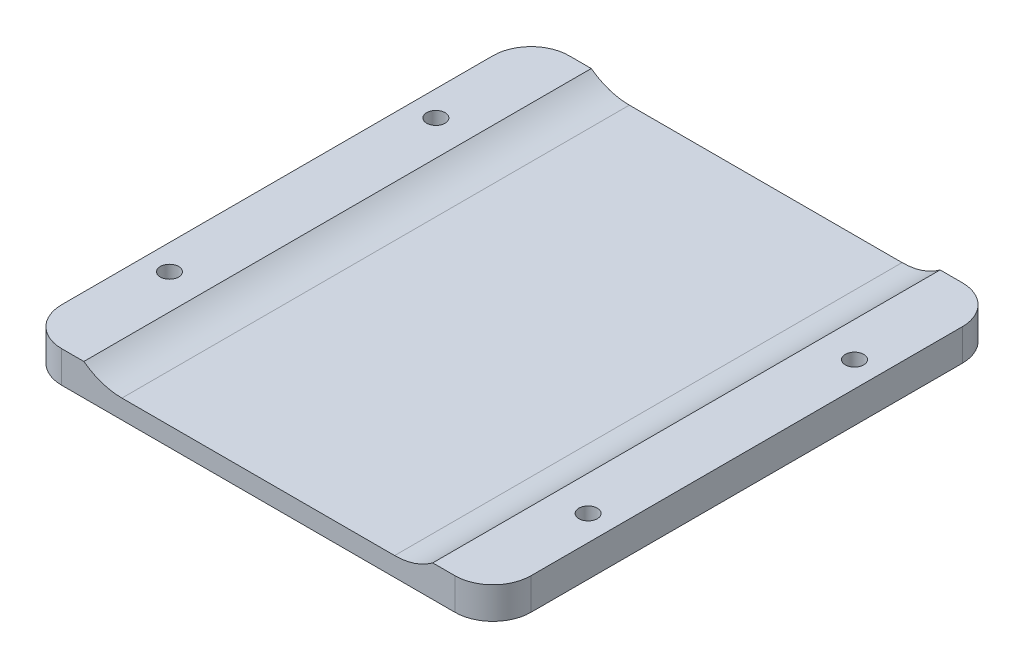
ISO-10303-21;
HEADER;
FILE_DESCRIPTION(('STEP AP214'),'2;1');
FILE_NAME('part.step','',(''),(''),'','','');
FILE_SCHEMA(('AUTOMOTIVE_DESIGN { 1 0 10303 214 1 1 1 1 }'));
ENDSEC;
DATA;
#1=APPLICATION_CONTEXT('core data for automotive mechanical design processes');
#2=APPLICATION_PROTOCOL_DEFINITION('international standard','automotive_design',2000,#1);
#3=PRODUCT_CONTEXT('',#1,'mechanical');
#4=PRODUCT('Part','Part','',(#3));
#5=PRODUCT_RELATED_PRODUCT_CATEGORY('part','',(#4));
#6=PRODUCT_DEFINITION_FORMATION('','',#4);
#7=PRODUCT_DEFINITION_CONTEXT('part definition',#1,'design');
#8=PRODUCT_DEFINITION('design','',#6,#7);
#9=PRODUCT_DEFINITION_SHAPE('','',#8);
#10=(LENGTH_UNIT() NAMED_UNIT(*) SI_UNIT(.MILLI.,.METRE.));
#11=(NAMED_UNIT(*) PLANE_ANGLE_UNIT() SI_UNIT($,.RADIAN.));
#12=(NAMED_UNIT(*) SI_UNIT($,.STERADIAN.) SOLID_ANGLE_UNIT());
#13=UNCERTAINTY_MEASURE_WITH_UNIT(LENGTH_MEASURE(1.E-05),#10,'distance_accuracy_value','');
#14=(GEOMETRIC_REPRESENTATION_CONTEXT(3) GLOBAL_UNCERTAINTY_ASSIGNED_CONTEXT((#13)) GLOBAL_UNIT_ASSIGNED_CONTEXT((#10,
#11,#12)) REPRESENTATION_CONTEXT('',''));
#15=CARTESIAN_POINT('',(0.,0.,0.));
#16=DIRECTION('',(0.,0.,1.));
#17=DIRECTION('',(1.,0.,0.));
#18=AXIS2_PLACEMENT_3D('',#15,#16,#17);
#19=CARTESIAN_POINT('',(0.,5.,0.));
#20=DIRECTION('',(0.,1.,0.));
#21=DIRECTION('',(0.,0.,1.));
#22=AXIS2_PLACEMENT_3D('',#19,#20,#21);
#23=PLANE('',#22);
#24=DIRECTION('',(0.,0.,-1.));
#25=VECTOR('',#24,1.);
#26=CARTESIAN_POINT('',(27.5,5.,40.));
#27=LINE('',#26,#25);
#28=CARTESIAN_POINT('',(27.5,5.,40.));
#29=VERTEX_POINT('',#28);
#30=CARTESIAN_POINT('',(27.5,5.,-40.));
#31=VERTEX_POINT('',#30);
#32=EDGE_CURVE('E141',#29,#31,#27,.T.);
#33=ORIENTED_EDGE('',*,*,#32,.F.);
#34=DIRECTION('',(1.,0.,0.));
#35=VECTOR('',#34,1.);
#36=CARTESIAN_POINT('',(-37.,5.,40.));
#37=LINE('',#36,#35);
#38=CARTESIAN_POINT('',(31.,5.,40.));
#39=VERTEX_POINT('',#38);
#40=EDGE_CURVE('E185',#29,#39,#37,.T.);
#41=ORIENTED_EDGE('',*,*,#40,.T.);
#42=CARTESIAN_POINT('',(31.,5.,34.));
#43=DIRECTION('',(0.,1.,0.));
#44=DIRECTION('',(0.,0.,1.));
#45=AXIS2_PLACEMENT_3D('',#42,#43,#44);
#46=CIRCLE('',#45,6.);
#47=CARTESIAN_POINT('',(37.,5.,34.));
#48=VERTEX_POINT('',#47);
#49=EDGE_CURVE('E217',#39,#48,#46,.T.);
#50=ORIENTED_EDGE('',*,*,#49,.T.);
#51=DIRECTION('',(0.,0.,-1.));
#52=VECTOR('',#51,1.);
#53=CARTESIAN_POINT('',(37.,5.,-40.));
#54=LINE('',#53,#52);
#55=CARTESIAN_POINT('',(37.,5.,-34.));
#56=VERTEX_POINT('',#55);
#57=EDGE_CURVE('E180',#48,#56,#54,.T.);
#58=ORIENTED_EDGE('',*,*,#57,.T.);
#59=CARTESIAN_POINT('',(31.,5.,-34.));
#60=DIRECTION('',(0.,1.,0.));
#61=DIRECTION('',(0.,0.,1.));
#62=AXIS2_PLACEMENT_3D('',#59,#60,#61);
#63=CIRCLE('',#62,6.);
#64=CARTESIAN_POINT('',(31.,5.,-40.));
#65=VERTEX_POINT('',#64);
#66=EDGE_CURVE('E144',#56,#65,#63,.T.);
#67=ORIENTED_EDGE('',*,*,#66,.T.);
#68=DIRECTION('',(-1.,0.,0.));
#69=VECTOR('',#68,1.);
#70=CARTESIAN_POINT('',(-37.,5.,-40.));
#71=LINE('',#70,#69);
#72=EDGE_CURVE('E130',#65,#31,#71,.T.);
#73=ORIENTED_EDGE('',*,*,#72,.T.);
#74=EDGE_LOOP('',(#33,#41,#50,#58,#67,#73));
#75=FACE_BOUND('',#74,.T.);
#76=CARTESIAN_POINT('',(33.,5.,-21.));
#77=DIRECTION('',(0.,1.,0.));
#78=DIRECTION('',(0.,0.,-1.));
#79=AXIS2_PLACEMENT_3D('',#76,#77,#78);
#80=CIRCLE('',#79,1.45);
#81=CARTESIAN_POINT('',(33.,5.,-22.45));
#82=VERTEX_POINT('',#81);
#83=EDGE_CURVE('E155',#82,#82,#80,.T.);
#84=ORIENTED_EDGE('',*,*,#83,.F.);
#85=EDGE_LOOP('',(#84));
#86=FACE_BOUND('',#85,.T.);
#87=CARTESIAN_POINT('',(33.,5.,21.));
#88=DIRECTION('',(0.,1.,0.));
#89=DIRECTION('',(0.,0.,1.));
#90=AXIS2_PLACEMENT_3D('',#87,#88,#89);
#91=CIRCLE('',#90,1.45);
#92=CARTESIAN_POINT('',(33.,5.,22.45));
#93=VERTEX_POINT('',#92);
#94=EDGE_CURVE('E162',#93,#93,#91,.T.);
#95=ORIENTED_EDGE('',*,*,#94,.F.);
#96=EDGE_LOOP('',(#95));
#97=FACE_BOUND('',#96,.T.);
#98=ADVANCED_FACE('F37',(#75,#86,#97),#23,.T.);
#99=DIRECTION('',(0.,0.,1.));
#100=VECTOR('',#99,1.);
#101=CARTESIAN_POINT('',(-27.5,5.,40.));
#102=LINE('',#101,#100);
#103=CARTESIAN_POINT('',(-27.5,5.,-40.));
#104=VERTEX_POINT('',#103);
#105=CARTESIAN_POINT('',(-27.5,5.,40.));
#106=VERTEX_POINT('',#105);
#107=EDGE_CURVE('E148',#104,#106,#102,.T.);
#108=ORIENTED_EDGE('',*,*,#107,.F.);
#109=CARTESIAN_POINT('',(-31.,5.,-40.));
#110=VERTEX_POINT('',#109);
#111=EDGE_CURVE('E146',#104,#110,#71,.T.);
#112=ORIENTED_EDGE('',*,*,#111,.T.);
#113=CARTESIAN_POINT('',(-31.,5.,-34.));
#114=DIRECTION('',(0.,1.,0.));
#115=DIRECTION('',(0.,0.,1.));
#116=AXIS2_PLACEMENT_3D('',#113,#114,#115);
#117=CIRCLE('',#116,6.);
#118=CARTESIAN_POINT('',(-37.,5.,-34.));
#119=VERTEX_POINT('',#118);
#120=EDGE_CURVE('E221',#110,#119,#117,.T.);
#121=ORIENTED_EDGE('',*,*,#120,.T.);
#122=DIRECTION('',(0.,0.,1.));
#123=VECTOR('',#122,1.);
#124=CARTESIAN_POINT('',(-37.,5.,-40.));
#125=LINE('',#124,#123);
#126=CARTESIAN_POINT('',(-37.,5.,34.));
#127=VERTEX_POINT('',#126);
#128=EDGE_CURVE('E145',#119,#127,#125,.T.);
#129=ORIENTED_EDGE('',*,*,#128,.T.);
#130=CARTESIAN_POINT('',(-31.,5.,34.));
#131=DIRECTION('',(0.,1.,0.));
#132=DIRECTION('',(0.,0.,1.));
#133=AXIS2_PLACEMENT_3D('',#130,#131,#132);
#134=CIRCLE('',#133,6.);
#135=CARTESIAN_POINT('',(-31.,5.,40.));
#136=VERTEX_POINT('',#135);
#137=EDGE_CURVE('E219',#127,#136,#134,.T.);
#138=ORIENTED_EDGE('',*,*,#137,.T.);
#139=EDGE_CURVE('E186',#136,#106,#37,.T.);
#140=ORIENTED_EDGE('',*,*,#139,.T.);
#141=EDGE_LOOP('',(#108,#112,#121,#129,#138,#140));
#142=FACE_BOUND('',#141,.T.);
#143=CARTESIAN_POINT('',(-33.,5.,-21.));
#144=DIRECTION('',(0.,1.,0.));
#145=DIRECTION('',(0.,0.,1.));
#146=AXIS2_PLACEMENT_3D('',#143,#144,#145);
#147=CIRCLE('',#146,1.45);
#148=CARTESIAN_POINT('',(-33.,5.,-19.55));
#149=VERTEX_POINT('',#148);
#150=EDGE_CURVE('E174',#149,#149,#147,.T.);
#151=ORIENTED_EDGE('',*,*,#150,.F.);
#152=EDGE_LOOP('',(#151));
#153=FACE_BOUND('',#152,.T.);
#154=CARTESIAN_POINT('',(-33.,5.,21.));
#155=DIRECTION('',(0.,1.,0.));
#156=DIRECTION('',(0.,0.,-1.));
#157=AXIS2_PLACEMENT_3D('',#154,#155,#156);
#158=CIRCLE('',#157,1.45);
#159=CARTESIAN_POINT('',(-33.,5.,19.55));
#160=VERTEX_POINT('',#159);
#161=EDGE_CURVE('E168',#160,#160,#158,.T.);
#162=ORIENTED_EDGE('',*,*,#161,.F.);
#163=EDGE_LOOP('',(#162));
#164=FACE_BOUND('',#163,.T.);
#165=ADVANCED_FACE('F254',(#142,#153,#164),#23,.T.);
#166=CARTESIAN_POINT('',(0.,0.,0.));
#167=DIRECTION('',(0.,1.,0.));
#168=DIRECTION('',(0.,0.,1.));
#169=AXIS2_PLACEMENT_3D('',#166,#167,#168);
#170=PLANE('',#169);
#171=DIRECTION('',(-1.,0.,0.));
#172=VECTOR('',#171,1.);
#173=CARTESIAN_POINT('',(-37.,0.,-40.));
#174=LINE('',#173,#172);
#175=CARTESIAN_POINT('',(31.,0.,-40.));
#176=VERTEX_POINT('',#175);
#177=CARTESIAN_POINT('',(-31.,0.,-40.));
#178=VERTEX_POINT('',#177);
#179=EDGE_CURVE('E192',#176,#178,#174,.T.);
#180=ORIENTED_EDGE('',*,*,#179,.F.);
#181=CARTESIAN_POINT('',(31.,0.,-34.));
#182=DIRECTION('',(0.,1.,0.));
#183=DIRECTION('',(0.,0.,1.));
#184=AXIS2_PLACEMENT_3D('',#181,#182,#183);
#185=CIRCLE('',#184,6.);
#186=CARTESIAN_POINT('',(37.,0.,-34.));
#187=VERTEX_POINT('',#186);
#188=EDGE_CURVE('E210',#176,#187,#185,.F.);
#189=ORIENTED_EDGE('',*,*,#188,.T.);
#190=DIRECTION('',(0.,0.,-1.));
#191=VECTOR('',#190,1.);
#192=CARTESIAN_POINT('',(37.,0.,-40.));
#193=LINE('',#192,#191);
#194=CARTESIAN_POINT('',(37.,0.,34.));
#195=VERTEX_POINT('',#194);
#196=EDGE_CURVE('E177',#195,#187,#193,.T.);
#197=ORIENTED_EDGE('',*,*,#196,.F.);
#198=CARTESIAN_POINT('',(31.,0.,34.));
#199=DIRECTION('',(0.,1.,0.));
#200=DIRECTION('',(0.,0.,1.));
#201=AXIS2_PLACEMENT_3D('',#198,#199,#200);
#202=CIRCLE('',#201,6.);
#203=CARTESIAN_POINT('',(31.,0.,40.));
#204=VERTEX_POINT('',#203);
#205=EDGE_CURVE('E204',#195,#204,#202,.F.);
#206=ORIENTED_EDGE('',*,*,#205,.T.);
#207=DIRECTION('',(1.,0.,0.));
#208=VECTOR('',#207,1.);
#209=CARTESIAN_POINT('',(-37.,0.,40.));
#210=LINE('',#209,#208);
#211=CARTESIAN_POINT('',(-31.,0.,40.));
#212=VERTEX_POINT('',#211);
#213=EDGE_CURVE('E181',#212,#204,#210,.T.);
#214=ORIENTED_EDGE('',*,*,#213,.F.);
#215=CARTESIAN_POINT('',(-31.,0.,34.));
#216=DIRECTION('',(0.,1.,0.));
#217=DIRECTION('',(0.,0.,1.));
#218=AXIS2_PLACEMENT_3D('',#215,#216,#217);
#219=CIRCLE('',#218,6.);
#220=CARTESIAN_POINT('',(-37.,0.,34.));
#221=VERTEX_POINT('',#220);
#222=EDGE_CURVE('E206',#212,#221,#219,.F.);
#223=ORIENTED_EDGE('',*,*,#222,.T.);
#224=DIRECTION('',(0.,0.,1.));
#225=VECTOR('',#224,1.);
#226=CARTESIAN_POINT('',(-37.,0.,-40.));
#227=LINE('',#226,#225);
#228=CARTESIAN_POINT('',(-37.,0.,-34.));
#229=VERTEX_POINT('',#228);
#230=EDGE_CURVE('E195',#229,#221,#227,.T.);
#231=ORIENTED_EDGE('',*,*,#230,.F.);
#232=CARTESIAN_POINT('',(-31.,0.,-34.));
#233=DIRECTION('',(0.,1.,0.));
#234=DIRECTION('',(0.,0.,1.));
#235=AXIS2_PLACEMENT_3D('',#232,#233,#234);
#236=CIRCLE('',#235,6.);
#237=EDGE_CURVE('E208',#229,#178,#236,.F.);
#238=ORIENTED_EDGE('',*,*,#237,.T.);
#239=EDGE_LOOP('',(#180,#189,#197,#206,#214,#223,#231,#238));
#240=FACE_BOUND('',#239,.T.);
#241=CARTESIAN_POINT('',(-33.,0.,-21.));
#242=DIRECTION('',(0.,1.,0.));
#243=DIRECTION('',(0.,0.,1.));
#244=AXIS2_PLACEMENT_3D('',#241,#242,#243);
#245=CIRCLE('',#244,1.45);
#246=CARTESIAN_POINT('',(-33.,0.,-19.55));
#247=VERTEX_POINT('',#246);
#248=EDGE_CURVE('E171',#247,#247,#245,.T.);
#249=ORIENTED_EDGE('',*,*,#248,.T.);
#250=EDGE_LOOP('',(#249));
#251=FACE_BOUND('',#250,.T.);
#252=CARTESIAN_POINT('',(-33.,0.,21.));
#253=DIRECTION('',(0.,1.,0.));
#254=DIRECTION('',(0.,0.,-1.));
#255=AXIS2_PLACEMENT_3D('',#252,#253,#254);
#256=CIRCLE('',#255,1.45);
#257=CARTESIAN_POINT('',(-33.,0.,19.55));
#258=VERTEX_POINT('',#257);
#259=EDGE_CURVE('E165',#258,#258,#256,.T.);
#260=ORIENTED_EDGE('',*,*,#259,.T.);
#261=EDGE_LOOP('',(#260));
#262=FACE_BOUND('',#261,.T.);
#263=CARTESIAN_POINT('',(33.,0.,21.));
#264=DIRECTION('',(0.,1.,0.));
#265=DIRECTION('',(0.,0.,1.));
#266=AXIS2_PLACEMENT_3D('',#263,#264,#265);
#267=CIRCLE('',#266,1.45);
#268=CARTESIAN_POINT('',(33.,0.,22.45));
#269=VERTEX_POINT('',#268);
#270=EDGE_CURVE('E158',#269,#269,#267,.T.);
#271=ORIENTED_EDGE('',*,*,#270,.T.);
#272=EDGE_LOOP('',(#271));
#273=FACE_BOUND('',#272,.T.);
#274=CARTESIAN_POINT('',(33.,0.,-21.));
#275=DIRECTION('',(0.,1.,0.));
#276=DIRECTION('',(0.,0.,-1.));
#277=AXIS2_PLACEMENT_3D('',#274,#275,#276);
#278=CIRCLE('',#277,1.45);
#279=CARTESIAN_POINT('',(33.,0.,-22.45));
#280=VERTEX_POINT('',#279);
#281=EDGE_CURVE('E159',#280,#280,#278,.T.);
#282=ORIENTED_EDGE('',*,*,#281,.T.);
#283=EDGE_LOOP('',(#282));
#284=FACE_BOUND('',#283,.T.);
#285=ADVANCED_FACE('F259',(#240,#251,#262,#273,#284),#170,.F.);
#286=CARTESIAN_POINT('',(37.,5.,-40.));
#287=DIRECTION('',(-1.,0.,0.));
#288=DIRECTION('',(0.,0.,1.));
#289=AXIS2_PLACEMENT_3D('',#286,#287,#288);
#290=PLANE('',#289);
#291=ORIENTED_EDGE('',*,*,#196,.T.);
#292=DIRECTION('',(0.,-1.,0.));
#293=VECTOR('',#292,1.);
#294=CARTESIAN_POINT('',(37.,5.,-34.));
#295=LINE('',#294,#293);
#296=EDGE_CURVE('E215',#187,#56,#295,.F.);
#297=ORIENTED_EDGE('',*,*,#296,.T.);
#298=ORIENTED_EDGE('',*,*,#57,.F.);
#299=DIRECTION('',(0.,-1.,0.));
#300=VECTOR('',#299,1.);
#301=CARTESIAN_POINT('',(37.,5.,34.));
#302=LINE('',#301,#300);
#303=EDGE_CURVE('E212',#48,#195,#302,.T.);
#304=ORIENTED_EDGE('',*,*,#303,.T.);
#305=EDGE_LOOP('',(#291,#297,#298,#304));
#306=FACE_BOUND('',#305,.T.);
#307=ADVANCED_FACE('F267',(#306),#290,.F.);
#308=CARTESIAN_POINT('',(-37.,5.,-40.));
#309=DIRECTION('',(0.,0.,1.));
#310=DIRECTION('',(1.,0.,0.));
#311=AXIS2_PLACEMENT_3D('',#308,#309,#310);
#312=PLANE('',#311);
#313=DIRECTION('',(-1.,0.,0.));
#314=VECTOR('',#313,1.);
#315=CARTESIAN_POINT('',(-27.5,3.,-40.));
#316=LINE('',#315,#314);
#317=CARTESIAN_POINT('',(21.5,3.,-40.));
#318=VERTEX_POINT('',#317);
#319=CARTESIAN_POINT('',(-21.5,3.,-40.));
#320=VERTEX_POINT('',#319);
#321=EDGE_CURVE('E133',#318,#320,#316,.T.);
#322=ORIENTED_EDGE('',*,*,#321,.F.);
#323=CARTESIAN_POINT('',(21.5,13.,-40.));
#324=DIRECTION('',(0.,0.,1.));
#325=DIRECTION('',(1.,0.,0.));
#326=AXIS2_PLACEMENT_3D('',#323,#324,#325);
#327=CIRCLE('',#326,10.);
#328=EDGE_CURVE('E45',#318,#31,#327,.T.);
#329=ORIENTED_EDGE('',*,*,#328,.T.);
#330=ORIENTED_EDGE('',*,*,#72,.F.);
#331=DIRECTION('',(0.,-1.,0.));
#332=VECTOR('',#331,1.);
#333=CARTESIAN_POINT('',(31.,5.,-40.));
#334=LINE('',#333,#332);
#335=EDGE_CURVE('E202',#65,#176,#334,.T.);
#336=ORIENTED_EDGE('',*,*,#335,.T.);
#337=ORIENTED_EDGE('',*,*,#179,.T.);
#338=DIRECTION('',(0.,-1.,0.));
#339=VECTOR('',#338,1.);
#340=CARTESIAN_POINT('',(-31.,5.,-40.));
#341=LINE('',#340,#339);
#342=EDGE_CURVE('E189',#178,#110,#341,.F.);
#343=ORIENTED_EDGE('',*,*,#342,.T.);
#344=ORIENTED_EDGE('',*,*,#111,.F.);
#345=CARTESIAN_POINT('',(-21.5,13.,-40.));
#346=DIRECTION('',(0.,0.,1.));
#347=DIRECTION('',(1.,0.,0.));
#348=AXIS2_PLACEMENT_3D('',#345,#346,#347);
#349=CIRCLE('',#348,10.);
#350=EDGE_CURVE('E138',#104,#320,#349,.T.);
#351=ORIENTED_EDGE('',*,*,#350,.T.);
#352=EDGE_LOOP('',(#322,#329,#330,#336,#337,#343,#344,#351));
#353=FACE_BOUND('',#352,.T.);
#354=ADVANCED_FACE('F128',(#353),#312,.F.);
#355=CARTESIAN_POINT('',(-37.,5.,-40.));
#356=DIRECTION('',(1.,0.,0.));
#357=DIRECTION('',(0.,0.,-1.));
#358=AXIS2_PLACEMENT_3D('',#355,#356,#357);
#359=PLANE('',#358);
#360=ORIENTED_EDGE('',*,*,#128,.F.);
#361=DIRECTION('',(0.,-1.,0.));
#362=VECTOR('',#361,1.);
#363=CARTESIAN_POINT('',(-37.,5.,-34.));
#364=LINE('',#363,#362);
#365=EDGE_CURVE('E226',#119,#229,#364,.T.);
#366=ORIENTED_EDGE('',*,*,#365,.T.);
#367=ORIENTED_EDGE('',*,*,#230,.T.);
#368=DIRECTION('',(0.,-1.,0.));
#369=VECTOR('',#368,1.);
#370=CARTESIAN_POINT('',(-37.,5.,34.));
#371=LINE('',#370,#369);
#372=EDGE_CURVE('E224',#221,#127,#371,.F.);
#373=ORIENTED_EDGE('',*,*,#372,.T.);
#374=EDGE_LOOP('',(#360,#366,#367,#373));
#375=FACE_BOUND('',#374,.T.);
#376=ADVANCED_FACE('F272',(#375),#359,.F.);
#377=CARTESIAN_POINT('',(-37.,5.,40.));
#378=DIRECTION('',(0.,0.,-1.));
#379=DIRECTION('',(-1.,0.,0.));
#380=AXIS2_PLACEMENT_3D('',#377,#378,#379);
#381=PLANE('',#380);
#382=ORIENTED_EDGE('',*,*,#40,.F.);
#383=CARTESIAN_POINT('',(21.5,13.,40.));
#384=DIRECTION('',(0.,0.,-1.));
#385=DIRECTION('',(-1.,0.,0.));
#386=AXIS2_PLACEMENT_3D('',#383,#384,#385);
#387=CIRCLE('',#386,10.);
#388=CARTESIAN_POINT('',(21.5,3.,40.));
#389=VERTEX_POINT('',#388);
#390=EDGE_CURVE('E11',#29,#389,#387,.T.);
#391=ORIENTED_EDGE('',*,*,#390,.T.);
#392=DIRECTION('',(1.,0.,0.));
#393=VECTOR('',#392,1.);
#394=CARTESIAN_POINT('',(-27.5,3.,40.));
#395=LINE('',#394,#393);
#396=CARTESIAN_POINT('',(-21.5,3.,40.));
#397=VERTEX_POINT('',#396);
#398=EDGE_CURVE('E152',#397,#389,#395,.T.);
#399=ORIENTED_EDGE('',*,*,#398,.F.);
#400=CARTESIAN_POINT('',(-21.5,13.,40.));
#401=DIRECTION('',(0.,0.,-1.));
#402=DIRECTION('',(-1.,0.,0.));
#403=AXIS2_PLACEMENT_3D('',#400,#401,#402);
#404=CIRCLE('',#403,10.);
#405=EDGE_CURVE('E58',#397,#106,#404,.T.);
#406=ORIENTED_EDGE('',*,*,#405,.T.);
#407=ORIENTED_EDGE('',*,*,#139,.F.);
#408=DIRECTION('',(0.,-1.,0.));
#409=VECTOR('',#408,1.);
#410=CARTESIAN_POINT('',(-31.,5.,40.));
#411=LINE('',#410,#409);
#412=EDGE_CURVE('E232',#136,#212,#411,.T.);
#413=ORIENTED_EDGE('',*,*,#412,.T.);
#414=ORIENTED_EDGE('',*,*,#213,.T.);
#415=DIRECTION('',(0.,-1.,0.));
#416=VECTOR('',#415,1.);
#417=CARTESIAN_POINT('',(31.,5.,40.));
#418=LINE('',#417,#416);
#419=EDGE_CURVE('E229',#204,#39,#418,.F.);
#420=ORIENTED_EDGE('',*,*,#419,.T.);
#421=EDGE_LOOP('',(#382,#391,#399,#406,#407,#413,#414,#420));
#422=FACE_BOUND('',#421,.T.);
#423=ADVANCED_FACE('F269',(#422),#381,.F.);
#424=CARTESIAN_POINT('',(-33.,5.,-21.));
#425=DIRECTION('',(0.,-1.,0.));
#426=DIRECTION('',(0.,0.,-1.));
#427=AXIS2_PLACEMENT_3D('',#424,#425,#426);
#428=CYLINDRICAL_SURFACE('',#427,1.45);
#429=ORIENTED_EDGE('',*,*,#150,.T.);
#430=EDGE_LOOP('',(#429));
#431=FACE_BOUND('',#430,.T.);
#432=ORIENTED_EDGE('',*,*,#248,.F.);
#433=EDGE_LOOP('',(#432));
#434=FACE_BOUND('',#433,.T.);
#435=ADVANCED_FACE('F263',(#431,#434),#428,.F.);
#436=CARTESIAN_POINT('',(-33.,5.,21.));
#437=DIRECTION('',(0.,-1.,0.));
#438=DIRECTION('',(0.,0.,-1.));
#439=AXIS2_PLACEMENT_3D('',#436,#437,#438);
#440=CYLINDRICAL_SURFACE('',#439,1.45);
#441=ORIENTED_EDGE('',*,*,#161,.T.);
#442=EDGE_LOOP('',(#441));
#443=FACE_BOUND('',#442,.T.);
#444=ORIENTED_EDGE('',*,*,#259,.F.);
#445=EDGE_LOOP('',(#444));
#446=FACE_BOUND('',#445,.T.);
#447=ADVANCED_FACE('F320',(#443,#446),#440,.F.);
#448=CARTESIAN_POINT('',(33.,5.,21.));
#449=DIRECTION('',(0.,-1.,0.));
#450=DIRECTION('',(0.,0.,-1.));
#451=AXIS2_PLACEMENT_3D('',#448,#449,#450);
#452=CYLINDRICAL_SURFACE('',#451,1.45);
#453=ORIENTED_EDGE('',*,*,#94,.T.);
#454=EDGE_LOOP('',(#453));
#455=FACE_BOUND('',#454,.T.);
#456=ORIENTED_EDGE('',*,*,#270,.F.);
#457=EDGE_LOOP('',(#456));
#458=FACE_BOUND('',#457,.T.);
#459=ADVANCED_FACE('F323',(#455,#458),#452,.F.);
#460=CARTESIAN_POINT('',(33.,5.,-21.));
#461=DIRECTION('',(0.,-1.,0.));
#462=DIRECTION('',(0.,0.,-1.));
#463=AXIS2_PLACEMENT_3D('',#460,#461,#462);
#464=CYLINDRICAL_SURFACE('',#463,1.45);
#465=ORIENTED_EDGE('',*,*,#83,.T.);
#466=EDGE_LOOP('',(#465));
#467=FACE_BOUND('',#466,.T.);
#468=ORIENTED_EDGE('',*,*,#281,.F.);
#469=EDGE_LOOP('',(#468));
#470=FACE_BOUND('',#469,.T.);
#471=ADVANCED_FACE('F285',(#467,#470),#464,.F.);
#472=CARTESIAN_POINT('',(31.,5.,-34.));
#473=DIRECTION('',(0.,-1.,0.));
#474=DIRECTION('',(0.,0.,-1.));
#475=AXIS2_PLACEMENT_3D('',#472,#473,#474);
#476=CYLINDRICAL_SURFACE('',#475,6.);
#477=ORIENTED_EDGE('',*,*,#66,.F.);
#478=ORIENTED_EDGE('',*,*,#296,.F.);
#479=ORIENTED_EDGE('',*,*,#188,.F.);
#480=ORIENTED_EDGE('',*,*,#335,.F.);
#481=EDGE_LOOP('',(#477,#478,#479,#480));
#482=FACE_BOUND('',#481,.T.);
#483=ADVANCED_FACE('F281',(#482),#476,.T.);
#484=CARTESIAN_POINT('',(-31.,5.,-34.));
#485=DIRECTION('',(0.,-1.,0.));
#486=DIRECTION('',(0.,0.,-1.));
#487=AXIS2_PLACEMENT_3D('',#484,#485,#486);
#488=CYLINDRICAL_SURFACE('',#487,6.);
#489=ORIENTED_EDGE('',*,*,#120,.F.);
#490=ORIENTED_EDGE('',*,*,#342,.F.);
#491=ORIENTED_EDGE('',*,*,#237,.F.);
#492=ORIENTED_EDGE('',*,*,#365,.F.);
#493=EDGE_LOOP('',(#489,#490,#491,#492));
#494=FACE_BOUND('',#493,.T.);
#495=ADVANCED_FACE('F284',(#494),#488,.T.);
#496=CARTESIAN_POINT('',(-31.,5.,34.));
#497=DIRECTION('',(0.,-1.,0.));
#498=DIRECTION('',(0.,0.,-1.));
#499=AXIS2_PLACEMENT_3D('',#496,#497,#498);
#500=CYLINDRICAL_SURFACE('',#499,6.);
#501=ORIENTED_EDGE('',*,*,#137,.F.);
#502=ORIENTED_EDGE('',*,*,#372,.F.);
#503=ORIENTED_EDGE('',*,*,#222,.F.);
#504=ORIENTED_EDGE('',*,*,#412,.F.);
#505=EDGE_LOOP('',(#501,#502,#503,#504));
#506=FACE_BOUND('',#505,.T.);
#507=ADVANCED_FACE('F289',(#506),#500,.T.);
#508=CARTESIAN_POINT('',(31.,5.,34.));
#509=DIRECTION('',(0.,-1.,0.));
#510=DIRECTION('',(0.,0.,-1.));
#511=AXIS2_PLACEMENT_3D('',#508,#509,#510);
#512=CYLINDRICAL_SURFACE('',#511,6.);
#513=ORIENTED_EDGE('',*,*,#49,.F.);
#514=ORIENTED_EDGE('',*,*,#419,.F.);
#515=ORIENTED_EDGE('',*,*,#205,.F.);
#516=ORIENTED_EDGE('',*,*,#303,.F.);
#517=EDGE_LOOP('',(#513,#514,#515,#516));
#518=FACE_BOUND('',#517,.T.);
#519=ADVANCED_FACE('F250',(#518),#512,.T.);
#520=CARTESIAN_POINT('',(0.,3.,0.));
#521=DIRECTION('',(0.,-1.,0.));
#522=DIRECTION('',(0.,0.,-1.));
#523=AXIS2_PLACEMENT_3D('',#520,#521,#522);
#524=PLANE('',#523);
#525=ORIENTED_EDGE('',*,*,#321,.T.);
#526=DIRECTION('',(0.,0.,-1.));
#527=VECTOR('',#526,1.);
#528=CARTESIAN_POINT('',(-21.5,3.,0.));
#529=LINE('',#528,#527);
#530=EDGE_CURVE('E237',#320,#397,#529,.F.);
#531=ORIENTED_EDGE('',*,*,#530,.T.);
#532=ORIENTED_EDGE('',*,*,#398,.T.);
#533=DIRECTION('',(0.,0.,1.));
#534=VECTOR('',#533,1.);
#535=CARTESIAN_POINT('',(21.5,3.,0.));
#536=LINE('',#535,#534);
#537=EDGE_CURVE('E235',#389,#318,#536,.F.);
#538=ORIENTED_EDGE('',*,*,#537,.T.);
#539=EDGE_LOOP('',(#525,#531,#532,#538));
#540=FACE_BOUND('',#539,.T.);
#541=ADVANCED_FACE('F243',(#540),#524,.F.);
#542=CARTESIAN_POINT('',(-21.5,13.,40.));
#543=DIRECTION('',(0.,0.,-1.));
#544=DIRECTION('',(-1.,0.,0.));
#545=AXIS2_PLACEMENT_3D('',#542,#543,#544);
#546=CYLINDRICAL_SURFACE('',#545,10.);
#547=ORIENTED_EDGE('',*,*,#350,.F.);
#548=ORIENTED_EDGE('',*,*,#107,.T.);
#549=ORIENTED_EDGE('',*,*,#405,.F.);
#550=ORIENTED_EDGE('',*,*,#530,.F.);
#551=EDGE_LOOP('',(#547,#548,#549,#550));
#552=FACE_BOUND('',#551,.T.);
#553=ADVANCED_FACE('F244',(#552),#546,.F.);
#554=CARTESIAN_POINT('',(21.5,13.,40.));
#555=DIRECTION('',(0.,0.,1.));
#556=DIRECTION('',(1.,0.,0.));
#557=AXIS2_PLACEMENT_3D('',#554,#555,#556);
#558=CYLINDRICAL_SURFACE('',#557,10.);
#559=ORIENTED_EDGE('',*,*,#390,.F.);
#560=ORIENTED_EDGE('',*,*,#32,.T.);
#561=ORIENTED_EDGE('',*,*,#328,.F.);
#562=ORIENTED_EDGE('',*,*,#537,.F.);
#563=EDGE_LOOP('',(#559,#560,#561,#562));
#564=FACE_BOUND('',#563,.T.);
#565=ADVANCED_FACE('F39',(#564),#558,.F.);
#566=CLOSED_SHELL('',(#98,#165,#285,#307,#354,#376,#423,#435,#447,#459,#471,#483,#495,#507,#519,
#541,#553,#565));
#567=MANIFOLD_SOLID_BREP('B2',#566);
#568=ADVANCED_BREP_SHAPE_REPRESENTATION('',(#18,#567),#14);
#569=SHAPE_DEFINITION_REPRESENTATION(#9,#568);
ENDSEC;
END-ISO-10303-21;
